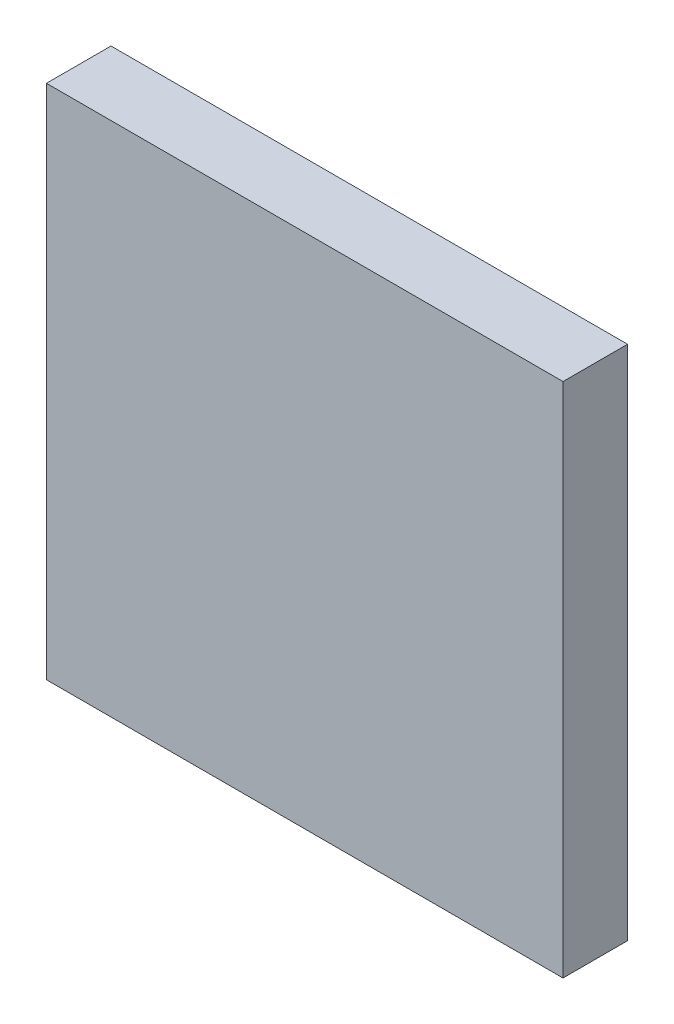
ISO-10303-21;
HEADER;
FILE_DESCRIPTION(('STEP AP214'),'2;1');
FILE_NAME('part.step','',(''),(''),'','','');
FILE_SCHEMA(('AUTOMOTIVE_DESIGN { 1 0 10303 214 1 1 1 1 }'));
ENDSEC;
DATA;
#1=APPLICATION_CONTEXT('core data for automotive mechanical design processes');
#2=APPLICATION_PROTOCOL_DEFINITION('international standard','automotive_design',2000,#1);
#3=PRODUCT_CONTEXT('',#1,'mechanical');
#4=PRODUCT('Part','Part','',(#3));
#5=PRODUCT_RELATED_PRODUCT_CATEGORY('part','',(#4));
#6=PRODUCT_DEFINITION_FORMATION('','',#4);
#7=PRODUCT_DEFINITION_CONTEXT('part definition',#1,'design');
#8=PRODUCT_DEFINITION('design','',#6,#7);
#9=PRODUCT_DEFINITION_SHAPE('','',#8);
#10=(LENGTH_UNIT() NAMED_UNIT(*) SI_UNIT(.MILLI.,.METRE.));
#11=(NAMED_UNIT(*) PLANE_ANGLE_UNIT() SI_UNIT($,.RADIAN.));
#12=(NAMED_UNIT(*) SI_UNIT($,.STERADIAN.) SOLID_ANGLE_UNIT());
#13=UNCERTAINTY_MEASURE_WITH_UNIT(LENGTH_MEASURE(1.E-05),#10,'distance_accuracy_value','');
#14=(GEOMETRIC_REPRESENTATION_CONTEXT(3) GLOBAL_UNCERTAINTY_ASSIGNED_CONTEXT((#13)) GLOBAL_UNIT_ASSIGNED_CONTEXT((#10,
#11,#12)) REPRESENTATION_CONTEXT('',''));
#15=CARTESIAN_POINT('',(0.,0.,0.));
#16=DIRECTION('',(0.,0.,1.));
#17=DIRECTION('',(1.,0.,0.));
#18=AXIS2_PLACEMENT_3D('',#15,#16,#17);
#19=CARTESIAN_POINT('',(0.,16.,0.));
#20=DIRECTION('',(0.,0.,-1.));
#21=DIRECTION('',(-1.,0.,0.));
#22=AXIS2_PLACEMENT_3D('',#19,#20,#21);
#23=PLANE('',#22);
#24=DIRECTION('',(0.,-1.,0.));
#25=VECTOR('',#24,1.);
#26=CARTESIAN_POINT('',(0.,0.,0.));
#27=LINE('',#26,#25);
#28=CARTESIAN_POINT('',(0.,16.,0.));
#29=VERTEX_POINT('',#28);
#30=CARTESIAN_POINT('',(0.,0.,0.));
#31=VERTEX_POINT('',#30);
#32=EDGE_CURVE('E130',#29,#31,#27,.T.);
#33=ORIENTED_EDGE('',*,*,#32,.F.);
#34=DIRECTION('',(-1.,0.,0.));
#35=VECTOR('',#34,1.);
#36=CARTESIAN_POINT('',(0.,16.,0.));
#37=LINE('',#36,#35);
#38=CARTESIAN_POINT('',(16.,16.,0.));
#39=VERTEX_POINT('',#38);
#40=EDGE_CURVE('E76',#39,#29,#37,.T.);
#41=ORIENTED_EDGE('',*,*,#40,.F.);
#42=DIRECTION('',(0.,1.,0.));
#43=VECTOR('',#42,1.);
#44=CARTESIAN_POINT('',(16.,0.,0.));
#45=LINE('',#44,#43);
#46=CARTESIAN_POINT('',(16.,0.,0.));
#47=VERTEX_POINT('',#46);
#48=EDGE_CURVE('E146',#47,#39,#45,.T.);
#49=ORIENTED_EDGE('',*,*,#48,.F.);
#50=DIRECTION('',(1.,0.,0.));
#51=VECTOR('',#50,1.);
#52=CARTESIAN_POINT('',(0.,0.,0.));
#53=LINE('',#52,#51);
#54=EDGE_CURVE('E133',#31,#47,#53,.T.);
#55=ORIENTED_EDGE('',*,*,#54,.F.);
#56=EDGE_LOOP('',(#33,#41,#49,#55));
#57=FACE_BOUND('',#56,.T.);
#58=DIRECTION('',(-1.,0.,0.));
#59=VECTOR('',#58,1.);
#60=CARTESIAN_POINT('',(10.,6.,0.));
#61=LINE('',#60,#59);
#62=CARTESIAN_POINT('',(10.,6.,0.));
#63=VERTEX_POINT('',#62);
#64=CARTESIAN_POINT('',(6.,6.,0.));
#65=VERTEX_POINT('',#64);
#66=EDGE_CURVE('E261',#63,#65,#61,.T.);
#67=ORIENTED_EDGE('',*,*,#66,.F.);
#68=DIRECTION('',(0.,-1.,0.));
#69=VECTOR('',#68,1.);
#70=CARTESIAN_POINT('',(10.,10.,0.));
#71=LINE('',#70,#69);
#72=CARTESIAN_POINT('',(10.,10.,0.));
#73=VERTEX_POINT('',#72);
#74=EDGE_CURVE('E128',#73,#63,#71,.T.);
#75=ORIENTED_EDGE('',*,*,#74,.F.);
#76=DIRECTION('',(1.,0.,0.));
#77=VECTOR('',#76,1.);
#78=CARTESIAN_POINT('',(10.,10.,0.));
#79=LINE('',#78,#77);
#80=CARTESIAN_POINT('',(6.,10.,0.));
#81=VERTEX_POINT('',#80);
#82=EDGE_CURVE('E124',#81,#73,#79,.T.);
#83=ORIENTED_EDGE('',*,*,#82,.F.);
#84=DIRECTION('',(0.,1.,0.));
#85=VECTOR('',#84,1.);
#86=CARTESIAN_POINT('',(6.,10.,0.));
#87=LINE('',#86,#85);
#88=EDGE_CURVE('E258',#65,#81,#87,.T.);
#89=ORIENTED_EDGE('',*,*,#88,.F.);
#90=EDGE_LOOP('',(#67,#75,#83,#89));
#91=FACE_BOUND('',#90,.T.);
#92=ADVANCED_FACE('F31',(#57,#91),#23,.T.);
#93=CARTESIAN_POINT('',(0.,0.,2.));
#94=DIRECTION('',(1.,0.,0.));
#95=DIRECTION('',(0.,0.,-1.));
#96=AXIS2_PLACEMENT_3D('',#93,#94,#95);
#97=PLANE('',#96);
#98=ORIENTED_EDGE('',*,*,#32,.T.);
#99=DIRECTION('',(0.,0.,-1.));
#100=VECTOR('',#99,1.);
#101=CARTESIAN_POINT('',(0.,0.,2.));
#102=LINE('',#101,#100);
#103=CARTESIAN_POINT('',(0.,0.,2.));
#104=VERTEX_POINT('',#103);
#105=EDGE_CURVE('E11',#104,#31,#102,.T.);
#106=ORIENTED_EDGE('',*,*,#105,.F.);
#107=DIRECTION('',(0.,-1.,0.));
#108=VECTOR('',#107,1.);
#109=CARTESIAN_POINT('',(0.,0.,2.));
#110=LINE('',#109,#108);
#111=CARTESIAN_POINT('',(0.,16.,2.));
#112=VERTEX_POINT('',#111);
#113=EDGE_CURVE('E138',#112,#104,#110,.T.);
#114=ORIENTED_EDGE('',*,*,#113,.F.);
#115=DIRECTION('',(0.,0.,-1.));
#116=VECTOR('',#115,1.);
#117=CARTESIAN_POINT('',(0.,16.,2.));
#118=LINE('',#117,#116);
#119=EDGE_CURVE('E143',#112,#29,#118,.T.);
#120=ORIENTED_EDGE('',*,*,#119,.T.);
#121=EDGE_LOOP('',(#98,#106,#114,#120));
#122=FACE_BOUND('',#121,.T.);
#123=ADVANCED_FACE('F33',(#122),#97,.F.);
#124=CARTESIAN_POINT('',(0.,0.,2.));
#125=DIRECTION('',(0.,1.,0.));
#126=DIRECTION('',(0.,0.,1.));
#127=AXIS2_PLACEMENT_3D('',#124,#125,#126);
#128=PLANE('',#127);
#129=ORIENTED_EDGE('',*,*,#54,.T.);
#130=DIRECTION('',(0.,0.,-1.));
#131=VECTOR('',#130,1.);
#132=CARTESIAN_POINT('',(16.,0.,2.));
#133=LINE('',#132,#131);
#134=CARTESIAN_POINT('',(16.,0.,2.));
#135=VERTEX_POINT('',#134);
#136=EDGE_CURVE('E39',#135,#47,#133,.T.);
#137=ORIENTED_EDGE('',*,*,#136,.F.);
#138=DIRECTION('',(1.,0.,0.));
#139=VECTOR('',#138,1.);
#140=CARTESIAN_POINT('',(0.,0.,2.));
#141=LINE('',#140,#139);
#142=EDGE_CURVE('E83',#104,#135,#141,.T.);
#143=ORIENTED_EDGE('',*,*,#142,.F.);
#144=ORIENTED_EDGE('',*,*,#105,.T.);
#145=EDGE_LOOP('',(#129,#137,#143,#144));
#146=FACE_BOUND('',#145,.T.);
#147=ADVANCED_FACE('F172',(#146),#128,.F.);
#148=CARTESIAN_POINT('',(16.,0.,2.));
#149=DIRECTION('',(-1.,0.,0.));
#150=DIRECTION('',(0.,0.,1.));
#151=AXIS2_PLACEMENT_3D('',#148,#149,#150);
#152=PLANE('',#151);
#153=ORIENTED_EDGE('',*,*,#48,.T.);
#154=DIRECTION('',(0.,0.,-1.));
#155=VECTOR('',#154,1.);
#156=CARTESIAN_POINT('',(16.,16.,2.));
#157=LINE('',#156,#155);
#158=CARTESIAN_POINT('',(16.,16.,2.));
#159=VERTEX_POINT('',#158);
#160=EDGE_CURVE('E150',#159,#39,#157,.T.);
#161=ORIENTED_EDGE('',*,*,#160,.F.);
#162=DIRECTION('',(0.,1.,0.));
#163=VECTOR('',#162,1.);
#164=CARTESIAN_POINT('',(16.,0.,2.));
#165=LINE('',#164,#163);
#166=EDGE_CURVE('E141',#135,#159,#165,.T.);
#167=ORIENTED_EDGE('',*,*,#166,.F.);
#168=ORIENTED_EDGE('',*,*,#136,.T.);
#169=EDGE_LOOP('',(#153,#161,#167,#168));
#170=FACE_BOUND('',#169,.T.);
#171=ADVANCED_FACE('F155',(#170),#152,.F.);
#172=CARTESIAN_POINT('',(0.,16.,2.));
#173=DIRECTION('',(0.,-1.,0.));
#174=DIRECTION('',(0.,0.,-1.));
#175=AXIS2_PLACEMENT_3D('',#172,#173,#174);
#176=PLANE('',#175);
#177=ORIENTED_EDGE('',*,*,#40,.T.);
#178=ORIENTED_EDGE('',*,*,#119,.F.);
#179=DIRECTION('',(-1.,0.,0.));
#180=VECTOR('',#179,1.);
#181=CARTESIAN_POINT('',(0.,16.,2.));
#182=LINE('',#181,#180);
#183=EDGE_CURVE('E55',#159,#112,#182,.T.);
#184=ORIENTED_EDGE('',*,*,#183,.F.);
#185=ORIENTED_EDGE('',*,*,#160,.T.);
#186=EDGE_LOOP('',(#177,#178,#184,#185));
#187=FACE_BOUND('',#186,.T.);
#188=ADVANCED_FACE('F163',(#187),#176,.F.);
#189=CARTESIAN_POINT('',(0.,16.,2.));
#190=DIRECTION('',(0.,0.,-1.));
#191=DIRECTION('',(-1.,0.,0.));
#192=AXIS2_PLACEMENT_3D('',#189,#190,#191);
#193=PLANE('',#192);
#194=ORIENTED_EDGE('',*,*,#113,.T.);
#195=ORIENTED_EDGE('',*,*,#142,.T.);
#196=ORIENTED_EDGE('',*,*,#166,.T.);
#197=ORIENTED_EDGE('',*,*,#183,.T.);
#198=EDGE_LOOP('',(#194,#195,#196,#197));
#199=FACE_BOUND('',#198,.T.);
#200=ADVANCED_FACE('F165',(#199),#193,.F.);
#201=CARTESIAN_POINT('',(10.,10.,-4.));
#202=DIRECTION('',(-1.,0.,0.));
#203=DIRECTION('',(0.,0.,1.));
#204=AXIS2_PLACEMENT_3D('',#201,#202,#203);
#205=PLANE('',#204);
#206=ORIENTED_EDGE('',*,*,#74,.T.);
#207=DIRECTION('',(0.,0.,1.));
#208=VECTOR('',#207,1.);
#209=CARTESIAN_POINT('',(10.,6.,-4.));
#210=LINE('',#209,#208);
#211=CARTESIAN_POINT('',(10.,6.,-4.));
#212=VERTEX_POINT('',#211);
#213=EDGE_CURVE('E109',#212,#63,#210,.T.);
#214=ORIENTED_EDGE('',*,*,#213,.F.);
#215=DIRECTION('',(0.,-1.,0.));
#216=VECTOR('',#215,1.);
#217=CARTESIAN_POINT('',(10.,10.,-4.));
#218=LINE('',#217,#216);
#219=CARTESIAN_POINT('',(10.,10.,-4.));
#220=VERTEX_POINT('',#219);
#221=EDGE_CURVE('E116',#220,#212,#218,.T.);
#222=ORIENTED_EDGE('',*,*,#221,.F.);
#223=DIRECTION('',(0.,0.,1.));
#224=VECTOR('',#223,1.);
#225=CARTESIAN_POINT('',(10.,10.,-4.));
#226=LINE('',#225,#224);
#227=EDGE_CURVE('E256',#220,#73,#226,.T.);
#228=ORIENTED_EDGE('',*,*,#227,.T.);
#229=EDGE_LOOP('',(#206,#214,#222,#228));
#230=FACE_BOUND('',#229,.T.);
#231=ADVANCED_FACE('F126',(#230),#205,.F.);
#232=CARTESIAN_POINT('',(10.,6.,-4.));
#233=DIRECTION('',(0.,1.,0.));
#234=DIRECTION('',(-1.,0.,0.));
#235=AXIS2_PLACEMENT_3D('',#232,#233,#234);
#236=PLANE('',#235);
#237=ORIENTED_EDGE('',*,*,#66,.T.);
#238=DIRECTION('',(0.,0.,1.));
#239=VECTOR('',#238,1.);
#240=CARTESIAN_POINT('',(6.,6.,-4.));
#241=LINE('',#240,#239);
#242=CARTESIAN_POINT('',(6.,6.,-4.));
#243=VERTEX_POINT('',#242);
#244=EDGE_CURVE('E112',#243,#65,#241,.T.);
#245=ORIENTED_EDGE('',*,*,#244,.F.);
#246=DIRECTION('',(-1.,0.,0.));
#247=VECTOR('',#246,1.);
#248=CARTESIAN_POINT('',(10.,6.,-4.));
#249=LINE('',#248,#247);
#250=EDGE_CURVE('E105',#212,#243,#249,.T.);
#251=ORIENTED_EDGE('',*,*,#250,.F.);
#252=ORIENTED_EDGE('',*,*,#213,.T.);
#253=EDGE_LOOP('',(#237,#245,#251,#252));
#254=FACE_BOUND('',#253,.T.);
#255=ADVANCED_FACE('F107',(#254),#236,.F.);
#256=CARTESIAN_POINT('',(6.,10.,-4.));
#257=DIRECTION('',(1.,0.,0.));
#258=DIRECTION('',(0.,1.,0.));
#259=AXIS2_PLACEMENT_3D('',#256,#257,#258);
#260=PLANE('',#259);
#261=ORIENTED_EDGE('',*,*,#88,.T.);
#262=DIRECTION('',(0.,0.,1.));
#263=VECTOR('',#262,1.);
#264=CARTESIAN_POINT('',(6.,10.,-4.));
#265=LINE('',#264,#263);
#266=CARTESIAN_POINT('',(6.,10.,-4.));
#267=VERTEX_POINT('',#266);
#268=EDGE_CURVE('E46',#267,#81,#265,.T.);
#269=ORIENTED_EDGE('',*,*,#268,.F.);
#270=DIRECTION('',(0.,1.,0.));
#271=VECTOR('',#270,1.);
#272=CARTESIAN_POINT('',(6.,10.,-4.));
#273=LINE('',#272,#271);
#274=EDGE_CURVE('E115',#243,#267,#273,.T.);
#275=ORIENTED_EDGE('',*,*,#274,.F.);
#276=ORIENTED_EDGE('',*,*,#244,.T.);
#277=EDGE_LOOP('',(#261,#269,#275,#276));
#278=FACE_BOUND('',#277,.T.);
#279=ADVANCED_FACE('F184',(#278),#260,.F.);
#280=CARTESIAN_POINT('',(10.,10.,-4.));
#281=DIRECTION('',(0.,-1.,0.));
#282=DIRECTION('',(1.,0.,0.));
#283=AXIS2_PLACEMENT_3D('',#280,#281,#282);
#284=PLANE('',#283);
#285=ORIENTED_EDGE('',*,*,#82,.T.);
#286=ORIENTED_EDGE('',*,*,#227,.F.);
#287=DIRECTION('',(1.,0.,0.));
#288=VECTOR('',#287,1.);
#289=CARTESIAN_POINT('',(10.,10.,-4.));
#290=LINE('',#289,#288);
#291=EDGE_CURVE('E120',#267,#220,#290,.T.);
#292=ORIENTED_EDGE('',*,*,#291,.F.);
#293=ORIENTED_EDGE('',*,*,#268,.T.);
#294=EDGE_LOOP('',(#285,#286,#292,#293));
#295=FACE_BOUND('',#294,.T.);
#296=ADVANCED_FACE('F187',(#295),#284,.F.);
#297=CARTESIAN_POINT('',(10.,6.,-4.));
#298=DIRECTION('',(0.,0.,-1.));
#299=DIRECTION('',(-1.,0.,0.));
#300=AXIS2_PLACEMENT_3D('',#297,#298,#299);
#301=PLANE('',#300);
#302=ORIENTED_EDGE('',*,*,#221,.T.);
#303=ORIENTED_EDGE('',*,*,#250,.T.);
#304=ORIENTED_EDGE('',*,*,#274,.T.);
#305=ORIENTED_EDGE('',*,*,#291,.T.);
#306=EDGE_LOOP('',(#302,#303,#304,#305));
#307=FACE_BOUND('',#306,.T.);
#308=ADVANCED_FACE('F119',(#307),#301,.T.);
#309=CLOSED_SHELL('',(#92,#123,#147,#171,#188,#200,#231,#255,#279,#296,#308));
#310=MANIFOLD_SOLID_BREP('B2',#309);
#311=ADVANCED_BREP_SHAPE_REPRESENTATION('',(#18,#310),#14);
#312=SHAPE_DEFINITION_REPRESENTATION(#9,#311);
ENDSEC;
END-ISO-10303-21;
